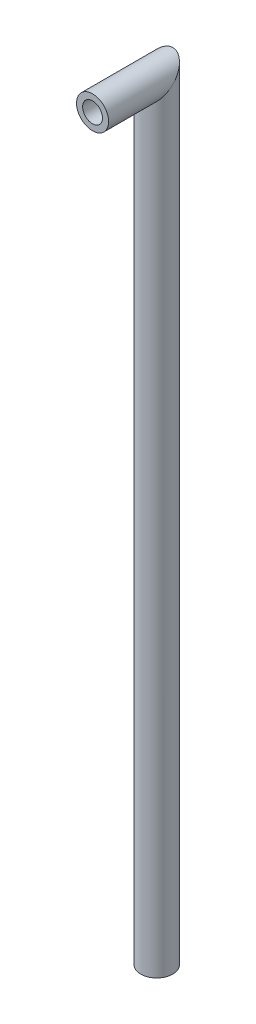
ISO-10303-21;
HEADER;
FILE_DESCRIPTION(('STEP AP214'),'2;1');
FILE_NAME('part.step','',(''),(''),'','','');
FILE_SCHEMA(('AUTOMOTIVE_DESIGN { 1 0 10303 214 1 1 1 1 }'));
ENDSEC;
DATA;
#1=APPLICATION_CONTEXT('core data for automotive mechanical design processes');
#2=APPLICATION_PROTOCOL_DEFINITION('international standard','automotive_design',2000,#1);
#3=PRODUCT_CONTEXT('',#1,'mechanical');
#4=PRODUCT('Part','Part','',(#3));
#5=PRODUCT_RELATED_PRODUCT_CATEGORY('part','',(#4));
#6=PRODUCT_DEFINITION_FORMATION('','',#4);
#7=PRODUCT_DEFINITION_CONTEXT('part definition',#1,'design');
#8=PRODUCT_DEFINITION('design','',#6,#7);
#9=PRODUCT_DEFINITION_SHAPE('','',#8);
#10=(LENGTH_UNIT() NAMED_UNIT(*) SI_UNIT(.MILLI.,.METRE.));
#11=(NAMED_UNIT(*) PLANE_ANGLE_UNIT() SI_UNIT($,.RADIAN.));
#12=(NAMED_UNIT(*) SI_UNIT($,.STERADIAN.) SOLID_ANGLE_UNIT());
#13=UNCERTAINTY_MEASURE_WITH_UNIT(LENGTH_MEASURE(1.E-05),#10,'distance_accuracy_value','');
#14=(GEOMETRIC_REPRESENTATION_CONTEXT(3) GLOBAL_UNCERTAINTY_ASSIGNED_CONTEXT((#13)) GLOBAL_UNIT_ASSIGNED_CONTEXT((#10,
#11,#12)) REPRESENTATION_CONTEXT('',''));
#15=CARTESIAN_POINT('',(0.,0.,0.));
#16=DIRECTION('',(0.,0.,1.));
#17=DIRECTION('',(1.,0.,0.));
#18=AXIS2_PLACEMENT_3D('',#15,#16,#17);
#19=CARTESIAN_POINT('',(0.,0.,-15.));
#20=DIRECTION('',(0.,0.,1.));
#21=DIRECTION('',(1.,0.,0.));
#22=AXIS2_PLACEMENT_3D('',#19,#20,#21);
#23=CYLINDRICAL_SURFACE('',#22,3.1);
#24=CARTESIAN_POINT('',(0.,0.,0.));
#25=DIRECTION('',(0.,0.,1.));
#26=DIRECTION('',(1.,0.,0.));
#27=AXIS2_PLACEMENT_3D('',#24,#25,#26);
#28=CIRCLE('',#27,3.1);
#29=CARTESIAN_POINT('',(3.1,0.,0.));
#30=VERTEX_POINT('',#29);
#31=EDGE_CURVE('E89',#30,#30,#28,.T.);
#32=ORIENTED_EDGE('',*,*,#31,.T.);
#33=EDGE_LOOP('',(#32));
#34=FACE_BOUND('',#33,.T.);
#35=DIRECTION('',(0.,0.,-1.));
#36=VECTOR('',#35,1.);
#37=CARTESIAN_POINT('',(1.68819430161341,-2.6,-6.));
#38=LINE('',#37,#36);
#39=CARTESIAN_POINT('',(1.68819430161341,-2.6,-6.));
#40=VERTEX_POINT('',#39);
#41=CARTESIAN_POINT('',(1.68819430161341,-2.6,-15.));
#42=VERTEX_POINT('',#41);
#43=EDGE_CURVE('E61',#40,#42,#38,.T.);
#44=ORIENTED_EDGE('',*,*,#43,.F.);
#45=CARTESIAN_POINT('',(0.,0.,-6.));
#46=DIRECTION('',(0.,0.,-1.));
#47=DIRECTION('',(-1.,0.,0.));
#48=AXIS2_PLACEMENT_3D('',#45,#46,#47);
#49=CIRCLE('',#48,3.1);
#50=CARTESIAN_POINT('',(-1.68819430161341,-2.6,-6.));
#51=VERTEX_POINT('',#50);
#52=EDGE_CURVE('E11',#51,#40,#49,.F.);
#53=ORIENTED_EDGE('',*,*,#52,.F.);
#54=DIRECTION('',(0.,0.,-1.));
#55=VECTOR('',#54,1.);
#56=CARTESIAN_POINT('',(-1.68819430161341,-2.6,-6.));
#57=LINE('',#56,#55);
#58=CARTESIAN_POINT('',(-1.68819430161341,-2.6,-15.));
#59=VERTEX_POINT('',#58);
#60=EDGE_CURVE('E74',#51,#59,#57,.T.);
#61=ORIENTED_EDGE('',*,*,#60,.T.);
#62=CARTESIAN_POINT('',(0.,0.,-15.));
#63=DIRECTION('',(0.,0.,1.));
#64=DIRECTION('',(1.,0.,0.));
#65=AXIS2_PLACEMENT_3D('',#62,#63,#64);
#66=CIRCLE('',#65,3.1);
#67=EDGE_CURVE('E83',#42,#59,#66,.T.);
#68=ORIENTED_EDGE('',*,*,#67,.F.);
#69=EDGE_LOOP('',(#44,#53,#61,#68));
#70=FACE_BOUND('',#69,.T.);
#71=ADVANCED_FACE('F45',(#34,#70),#23,.F.);
#72=CARTESIAN_POINT('',(0.,0.,-15.));
#73=DIRECTION('',(0.,0.,1.));
#74=DIRECTION('',(1.,0.,0.));
#75=AXIS2_PLACEMENT_3D('',#72,#73,#74);
#76=PLANE('',#75);
#77=ORIENTED_EDGE('',*,*,#67,.T.);
#78=DIRECTION('',(-1.,0.,0.));
#79=VECTOR('',#78,1.);
#80=CARTESIAN_POINT('',(-1.68819430161341,-2.6,-15.));
#81=LINE('',#80,#79);
#82=EDGE_CURVE('E71',#42,#59,#81,.T.);
#83=ORIENTED_EDGE('',*,*,#82,.F.);
#84=EDGE_LOOP('',(#77,#83));
#85=FACE_BOUND('',#84,.T.);
#86=ADVANCED_FACE('F86',(#85),#76,.T.);
#87=CARTESIAN_POINT('',(0.,-240.,-20.));
#88=DIRECTION('',(0.,1.,0.));
#89=DIRECTION('',(1.,0.,0.));
#90=AXIS2_PLACEMENT_3D('',#87,#88,#89);
#91=PLANE('',#90);
#92=CARTESIAN_POINT('',(0.,-240.,-20.));
#93=DIRECTION('',(0.,-1.,0.));
#94=DIRECTION('',(0.,0.,-1.));
#95=AXIS2_PLACEMENT_3D('',#92,#93,#94);
#96=CIRCLE('',#95,3.1);
#97=CARTESIAN_POINT('',(0.,-240.,-23.1));
#98=VERTEX_POINT('',#97);
#99=EDGE_CURVE('E145',#98,#98,#96,.T.);
#100=ORIENTED_EDGE('',*,*,#99,.F.);
#101=EDGE_LOOP('',(#100));
#102=FACE_BOUND('',#101,.T.);
#103=CARTESIAN_POINT('',(0.,-240.,-20.));
#104=DIRECTION('',(0.,1.,0.));
#105=DIRECTION('',(1.,0.,0.));
#106=AXIS2_PLACEMENT_3D('',#103,#104,#105);
#107=CIRCLE('',#106,5.);
#108=CARTESIAN_POINT('',(5.,-240.,-20.));
#109=VERTEX_POINT('',#108);
#110=EDGE_CURVE('E88',#109,#109,#107,.T.);
#111=ORIENTED_EDGE('',*,*,#110,.F.);
#112=EDGE_LOOP('',(#111));
#113=FACE_BOUND('',#112,.T.);
#114=ADVANCED_FACE('F47',(#102,#113),#91,.F.);
#115=CARTESIAN_POINT('',(0.,0.,0.));
#116=DIRECTION('',(0.,0.,1.));
#117=DIRECTION('',(1.,0.,0.));
#118=AXIS2_PLACEMENT_3D('',#115,#116,#117);
#119=PLANE('',#118);
#120=ORIENTED_EDGE('',*,*,#31,.F.);
#121=EDGE_LOOP('',(#120));
#122=FACE_BOUND('',#121,.T.);
#123=CARTESIAN_POINT('',(0.,0.,0.));
#124=DIRECTION('',(0.,0.,1.));
#125=DIRECTION('',(1.,0.,0.));
#126=AXIS2_PLACEMENT_3D('',#123,#124,#125);
#127=CIRCLE('',#126,5.);
#128=CARTESIAN_POINT('',(5.,0.,0.));
#129=VERTEX_POINT('',#128);
#130=EDGE_CURVE('E94',#129,#129,#127,.T.);
#131=ORIENTED_EDGE('',*,*,#130,.T.);
#132=EDGE_LOOP('',(#131));
#133=FACE_BOUND('',#132,.T.);
#134=ADVANCED_FACE('F120',(#122,#133),#119,.T.);
#135=CARTESIAN_POINT('',(0.,11.1,-20.));
#136=DIRECTION('',(0.,-1.,0.));
#137=DIRECTION('',(0.,0.,-1.));
#138=AXIS2_PLACEMENT_3D('',#135,#136,#137);
#139=CYLINDRICAL_SURFACE('',#138,5.);
#140=CARTESIAN_POINT('',(0.,0.,-20.));
#141=DIRECTION('',(0.,-0.707106781186547,-0.707106781186547));
#142=DIRECTION('',(0.,0.707106781186548,-0.707106781186548));
#143=AXIS2_PLACEMENT_3D('',#140,#141,#142);
#144=ELLIPSE('',#143,7.07106781186548,5.);
#145=CARTESIAN_POINT('',(0.,5.,-25.));
#146=VERTEX_POINT('',#145);
#147=EDGE_CURVE('E54',#146,#146,#144,.T.);
#148=ORIENTED_EDGE('',*,*,#147,.T.);
#149=EDGE_LOOP('',(#148));
#150=FACE_BOUND('',#149,.T.);
#151=ORIENTED_EDGE('',*,*,#110,.T.);
#152=EDGE_LOOP('',(#151));
#153=FACE_BOUND('',#152,.T.);
#154=ADVANCED_FACE('F106',(#150,#153),#139,.T.);
#155=CARTESIAN_POINT('',(0.,0.,0.));
#156=DIRECTION('',(0.,0.,-1.));
#157=DIRECTION('',(-1.,0.,0.));
#158=AXIS2_PLACEMENT_3D('',#155,#156,#157);
#159=CYLINDRICAL_SURFACE('',#158,5.);
#160=ORIENTED_EDGE('',*,*,#130,.F.);
#161=EDGE_LOOP('',(#160));
#162=FACE_BOUND('',#161,.T.);
#163=ORIENTED_EDGE('',*,*,#147,.F.);
#164=EDGE_LOOP('',(#163));
#165=FACE_BOUND('',#164,.T.);
#166=ADVANCED_FACE('F109',(#162,#165),#159,.T.);
#167=CARTESIAN_POINT('',(0.,0.,-6.));
#168=DIRECTION('',(0.,0.,-1.));
#169=DIRECTION('',(-1.,0.,0.));
#170=AXIS2_PLACEMENT_3D('',#167,#168,#169);
#171=PLANE('',#170);
#172=DIRECTION('',(-1.,0.,0.));
#173=VECTOR('',#172,1.);
#174=CARTESIAN_POINT('',(-1.68819430161341,-2.6,-6.));
#175=LINE('',#174,#173);
#176=EDGE_CURVE('E67',#40,#51,#175,.T.);
#177=ORIENTED_EDGE('',*,*,#176,.T.);
#178=ORIENTED_EDGE('',*,*,#52,.T.);
#179=EDGE_LOOP('',(#177,#178));
#180=FACE_BOUND('',#179,.T.);
#181=ADVANCED_FACE('F111',(#180),#171,.F.);
#182=CARTESIAN_POINT('',(-1.68819430161341,-2.6,-6.));
#183=DIRECTION('',(0.,-1.,0.));
#184=DIRECTION('',(0.,0.,-1.));
#185=AXIS2_PLACEMENT_3D('',#182,#183,#184);
#186=PLANE('',#185);
#187=ORIENTED_EDGE('',*,*,#82,.T.);
#188=ORIENTED_EDGE('',*,*,#60,.F.);
#189=ORIENTED_EDGE('',*,*,#176,.F.);
#190=ORIENTED_EDGE('',*,*,#43,.T.);
#191=EDGE_LOOP('',(#187,#188,#189,#190));
#192=FACE_BOUND('',#191,.T.);
#193=ADVANCED_FACE('F73',(#192),#186,.F.);
#194=CARTESIAN_POINT('',(0.,2.22044604925031E-13,-20.));
#195=DIRECTION('',(0.,-1.,0.));
#196=DIRECTION('',(0.,0.,-1.));
#197=AXIS2_PLACEMENT_3D('',#194,#195,#196);
#198=CYLINDRICAL_SURFACE('',#197,3.1);
#199=CARTESIAN_POINT('',(0.,2.22044604925031E-13,-20.));
#200=DIRECTION('',(0.,-1.,0.));
#201=DIRECTION('',(0.,0.,-1.));
#202=AXIS2_PLACEMENT_3D('',#199,#200,#201);
#203=CIRCLE('',#202,3.1);
#204=CARTESIAN_POINT('',(0.,2.22234425178899E-13,-23.1));
#205=VERTEX_POINT('',#204);
#206=EDGE_CURVE('E80',#205,#205,#203,.T.);
#207=ORIENTED_EDGE('',*,*,#206,.F.);
#208=EDGE_LOOP('',(#207));
#209=FACE_BOUND('',#208,.T.);
#210=ORIENTED_EDGE('',*,*,#99,.T.);
#211=EDGE_LOOP('',(#210));
#212=FACE_BOUND('',#211,.T.);
#213=ADVANCED_FACE('F132',(#209,#212),#198,.F.);
#214=CARTESIAN_POINT('',(0.,2.22044604925031E-13,-20.));
#215=DIRECTION('',(0.,-1.,0.));
#216=DIRECTION('',(0.,0.,-1.));
#217=AXIS2_PLACEMENT_3D('',#214,#215,#216);
#218=PLANE('',#217);
#219=ORIENTED_EDGE('',*,*,#206,.T.);
#220=EDGE_LOOP('',(#219));
#221=FACE_BOUND('',#220,.T.);
#222=ADVANCED_FACE('F136',(#221),#218,.T.);
#223=CLOSED_SHELL('',(#71,#86,#114,#134,#154,#166,#181,#193,#213,#222));
#224=MANIFOLD_SOLID_BREP('B2',#223);
#225=ADVANCED_BREP_SHAPE_REPRESENTATION('',(#18,#224),#14);
#226=SHAPE_DEFINITION_REPRESENTATION(#9,#225);
ENDSEC;
END-ISO-10303-21;
